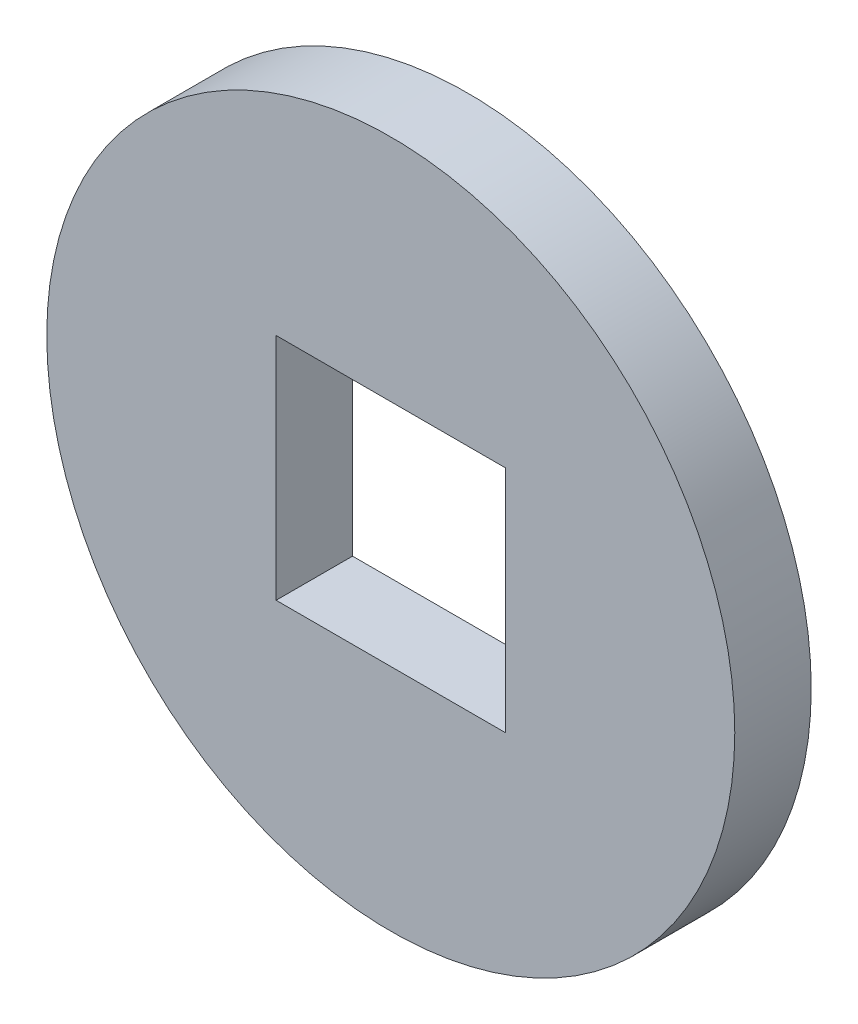
ISO-10303-21;
HEADER;
FILE_DESCRIPTION(('STEP AP214'),'2;1');
FILE_NAME('part.step','',(''),(''),'','','');
FILE_SCHEMA(('AUTOMOTIVE_DESIGN { 1 0 10303 214 1 1 1 1 }'));
ENDSEC;
DATA;
#1=APPLICATION_CONTEXT('core data for automotive mechanical design processes');
#2=APPLICATION_PROTOCOL_DEFINITION('international standard','automotive_design',2000,#1);
#3=PRODUCT_CONTEXT('',#1,'mechanical');
#4=PRODUCT('Part','Part','',(#3));
#5=PRODUCT_RELATED_PRODUCT_CATEGORY('part','',(#4));
#6=PRODUCT_DEFINITION_FORMATION('','',#4);
#7=PRODUCT_DEFINITION_CONTEXT('part definition',#1,'design');
#8=PRODUCT_DEFINITION('design','',#6,#7);
#9=PRODUCT_DEFINITION_SHAPE('','',#8);
#10=(LENGTH_UNIT() NAMED_UNIT(*) SI_UNIT(.MILLI.,.METRE.));
#11=(NAMED_UNIT(*) PLANE_ANGLE_UNIT() SI_UNIT($,.RADIAN.));
#12=(NAMED_UNIT(*) SI_UNIT($,.STERADIAN.) SOLID_ANGLE_UNIT());
#13=UNCERTAINTY_MEASURE_WITH_UNIT(LENGTH_MEASURE(1.E-05),#10,'distance_accuracy_value','');
#14=(GEOMETRIC_REPRESENTATION_CONTEXT(3) GLOBAL_UNCERTAINTY_ASSIGNED_CONTEXT((#13)) GLOBAL_UNIT_ASSIGNED_CONTEXT((#10,
#11,#12)) REPRESENTATION_CONTEXT('',''));
#15=CARTESIAN_POINT('',(0.,0.,0.));
#16=DIRECTION('',(0.,0.,1.));
#17=DIRECTION('',(1.,0.,0.));
#18=AXIS2_PLACEMENT_3D('',#15,#16,#17);
#19=CARTESIAN_POINT('',(0.,0.,1.));
#20=DIRECTION('',(0.,0.,1.));
#21=DIRECTION('',(1.,0.,0.));
#22=AXIS2_PLACEMENT_3D('',#19,#20,#21);
#23=PLANE('',#22);
#24=CARTESIAN_POINT('',(0.,0.,1.));
#25=DIRECTION('',(0.,0.,1.));
#26=DIRECTION('',(1.,0.,0.));
#27=AXIS2_PLACEMENT_3D('',#24,#25,#26);
#28=CIRCLE('',#27,4.5);
#29=CARTESIAN_POINT('',(4.5,0.,1.));
#30=VERTEX_POINT('',#29);
#31=EDGE_CURVE('E11',#30,#30,#28,.T.);
#32=ORIENTED_EDGE('',*,*,#31,.T.);
#33=EDGE_LOOP('',(#32));
#34=FACE_BOUND('',#33,.T.);
#35=DIRECTION('',(1.,0.,0.));
#36=VECTOR('',#35,1.);
#37=CARTESIAN_POINT('',(1.5,-1.5,1.));
#38=LINE('',#37,#36);
#39=CARTESIAN_POINT('',(-1.5,-1.5,1.));
#40=VERTEX_POINT('',#39);
#41=CARTESIAN_POINT('',(1.5,-1.5,1.));
#42=VERTEX_POINT('',#41);
#43=EDGE_CURVE('E84',#40,#42,#38,.T.);
#44=ORIENTED_EDGE('',*,*,#43,.F.);
#45=DIRECTION('',(0.,-1.,0.));
#46=VECTOR('',#45,1.);
#47=CARTESIAN_POINT('',(-1.5,1.5,1.));
#48=LINE('',#47,#46);
#49=CARTESIAN_POINT('',(-1.5,1.5,1.));
#50=VERTEX_POINT('',#49);
#51=EDGE_CURVE('E76',#50,#40,#48,.T.);
#52=ORIENTED_EDGE('',*,*,#51,.F.);
#53=DIRECTION('',(-1.,0.,0.));
#54=VECTOR('',#53,1.);
#55=CARTESIAN_POINT('',(1.5,1.5,1.));
#56=LINE('',#55,#54);
#57=CARTESIAN_POINT('',(1.5,1.5,1.));
#58=VERTEX_POINT('',#57);
#59=EDGE_CURVE('E97',#58,#50,#56,.T.);
#60=ORIENTED_EDGE('',*,*,#59,.F.);
#61=DIRECTION('',(0.,1.,0.));
#62=VECTOR('',#61,1.);
#63=CARTESIAN_POINT('',(1.5,1.5,1.));
#64=LINE('',#63,#62);
#65=EDGE_CURVE('E95',#42,#58,#64,.T.);
#66=ORIENTED_EDGE('',*,*,#65,.F.);
#67=EDGE_LOOP('',(#44,#52,#60,#66));
#68=FACE_BOUND('',#67,.T.);
#69=ADVANCED_FACE('F35',(#34,#68),#23,.T.);
#70=CARTESIAN_POINT('',(0.,0.,0.));
#71=DIRECTION('',(0.,0.,1.));
#72=DIRECTION('',(1.,0.,0.));
#73=AXIS2_PLACEMENT_3D('',#70,#71,#72);
#74=PLANE('',#73);
#75=CARTESIAN_POINT('',(0.,0.,0.));
#76=DIRECTION('',(0.,0.,1.));
#77=DIRECTION('',(1.,0.,0.));
#78=AXIS2_PLACEMENT_3D('',#75,#76,#77);
#79=CIRCLE('',#78,4.5);
#80=CARTESIAN_POINT('',(4.5,0.,0.));
#81=VERTEX_POINT('',#80);
#82=EDGE_CURVE('E39',#81,#81,#79,.T.);
#83=ORIENTED_EDGE('',*,*,#82,.F.);
#84=EDGE_LOOP('',(#83));
#85=FACE_BOUND('',#84,.T.);
#86=DIRECTION('',(0.,-1.,0.));
#87=VECTOR('',#86,1.);
#88=CARTESIAN_POINT('',(-1.5,1.5,0.));
#89=LINE('',#88,#87);
#90=CARTESIAN_POINT('',(-1.5,1.5,0.));
#91=VERTEX_POINT('',#90);
#92=CARTESIAN_POINT('',(-1.5,-1.5,0.));
#93=VERTEX_POINT('',#92);
#94=EDGE_CURVE('E58',#91,#93,#89,.T.);
#95=ORIENTED_EDGE('',*,*,#94,.T.);
#96=DIRECTION('',(1.,0.,0.));
#97=VECTOR('',#96,1.);
#98=CARTESIAN_POINT('',(1.5,-1.5,0.));
#99=LINE('',#98,#97);
#100=CARTESIAN_POINT('',(1.5,-1.5,0.));
#101=VERTEX_POINT('',#100);
#102=EDGE_CURVE('E91',#93,#101,#99,.T.);
#103=ORIENTED_EDGE('',*,*,#102,.T.);
#104=DIRECTION('',(0.,1.,0.));
#105=VECTOR('',#104,1.);
#106=CARTESIAN_POINT('',(1.5,1.5,0.));
#107=LINE('',#106,#105);
#108=CARTESIAN_POINT('',(1.5,1.5,0.));
#109=VERTEX_POINT('',#108);
#110=EDGE_CURVE('E103',#101,#109,#107,.T.);
#111=ORIENTED_EDGE('',*,*,#110,.T.);
#112=DIRECTION('',(-1.,0.,0.));
#113=VECTOR('',#112,1.);
#114=CARTESIAN_POINT('',(1.5,1.5,0.));
#115=LINE('',#114,#113);
#116=EDGE_CURVE('E85',#109,#91,#115,.T.);
#117=ORIENTED_EDGE('',*,*,#116,.T.);
#118=EDGE_LOOP('',(#95,#103,#111,#117));
#119=FACE_BOUND('',#118,.T.);
#120=ADVANCED_FACE('F114',(#85,#119),#74,.F.);
#121=CARTESIAN_POINT('',(0.,0.,1.));
#122=DIRECTION('',(0.,0.,-1.));
#123=DIRECTION('',(-1.,0.,0.));
#124=AXIS2_PLACEMENT_3D('',#121,#122,#123);
#125=CYLINDRICAL_SURFACE('',#124,4.5);
#126=ORIENTED_EDGE('',*,*,#31,.F.);
#127=EDGE_LOOP('',(#126));
#128=FACE_BOUND('',#127,.T.);
#129=ORIENTED_EDGE('',*,*,#82,.T.);
#130=EDGE_LOOP('',(#129));
#131=FACE_BOUND('',#130,.T.);
#132=ADVANCED_FACE('F37',(#128,#131),#125,.T.);
#133=CARTESIAN_POINT('',(-1.5,1.5,1.));
#134=DIRECTION('',(1.,0.,0.));
#135=DIRECTION('',(0.,1.,0.));
#136=AXIS2_PLACEMENT_3D('',#133,#134,#135);
#137=PLANE('',#136);
#138=ORIENTED_EDGE('',*,*,#94,.F.);
#139=DIRECTION('',(0.,0.,-1.));
#140=VECTOR('',#139,1.);
#141=CARTESIAN_POINT('',(-1.5,1.5,1.));
#142=LINE('',#141,#140);
#143=EDGE_CURVE('E80',#50,#91,#142,.T.);
#144=ORIENTED_EDGE('',*,*,#143,.F.);
#145=ORIENTED_EDGE('',*,*,#51,.T.);
#146=DIRECTION('',(0.,0.,-1.));
#147=VECTOR('',#146,1.);
#148=CARTESIAN_POINT('',(-1.5,-1.5,1.));
#149=LINE('',#148,#147);
#150=EDGE_CURVE('E79',#40,#93,#149,.T.);
#151=ORIENTED_EDGE('',*,*,#150,.T.);
#152=EDGE_LOOP('',(#138,#144,#145,#151));
#153=FACE_BOUND('',#152,.T.);
#154=ADVANCED_FACE('F78',(#153),#137,.T.);
#155=CARTESIAN_POINT('',(1.5,-1.5,1.));
#156=DIRECTION('',(0.,1.,0.));
#157=DIRECTION('',(-1.,0.,0.));
#158=AXIS2_PLACEMENT_3D('',#155,#156,#157);
#159=PLANE('',#158);
#160=ORIENTED_EDGE('',*,*,#102,.F.);
#161=ORIENTED_EDGE('',*,*,#150,.F.);
#162=ORIENTED_EDGE('',*,*,#43,.T.);
#163=DIRECTION('',(0.,0.,-1.));
#164=VECTOR('',#163,1.);
#165=CARTESIAN_POINT('',(1.5,-1.5,1.));
#166=LINE('',#165,#164);
#167=EDGE_CURVE('E92',#42,#101,#166,.T.);
#168=ORIENTED_EDGE('',*,*,#167,.T.);
#169=EDGE_LOOP('',(#160,#161,#162,#168));
#170=FACE_BOUND('',#169,.T.);
#171=ADVANCED_FACE('F88',(#170),#159,.T.);
#172=CARTESIAN_POINT('',(1.5,1.5,1.));
#173=DIRECTION('',(-1.,0.,0.));
#174=DIRECTION('',(0.,-1.,0.));
#175=AXIS2_PLACEMENT_3D('',#172,#173,#174);
#176=PLANE('',#175);
#177=ORIENTED_EDGE('',*,*,#110,.F.);
#178=ORIENTED_EDGE('',*,*,#167,.F.);
#179=ORIENTED_EDGE('',*,*,#65,.T.);
#180=DIRECTION('',(0.,0.,-1.));
#181=VECTOR('',#180,1.);
#182=CARTESIAN_POINT('',(1.5,1.5,1.));
#183=LINE('',#182,#181);
#184=EDGE_CURVE('E50',#58,#109,#183,.T.);
#185=ORIENTED_EDGE('',*,*,#184,.T.);
#186=EDGE_LOOP('',(#177,#178,#179,#185));
#187=FACE_BOUND('',#186,.T.);
#188=ADVANCED_FACE('F112',(#187),#176,.T.);
#189=CARTESIAN_POINT('',(1.5,1.5,1.));
#190=DIRECTION('',(0.,-1.,0.));
#191=DIRECTION('',(1.,0.,0.));
#192=AXIS2_PLACEMENT_3D('',#189,#190,#191);
#193=PLANE('',#192);
#194=ORIENTED_EDGE('',*,*,#116,.F.);
#195=ORIENTED_EDGE('',*,*,#184,.F.);
#196=ORIENTED_EDGE('',*,*,#59,.T.);
#197=ORIENTED_EDGE('',*,*,#143,.T.);
#198=EDGE_LOOP('',(#194,#195,#196,#197));
#199=FACE_BOUND('',#198,.T.);
#200=ADVANCED_FACE('F115',(#199),#193,.T.);
#201=CLOSED_SHELL('',(#69,#120,#132,#154,#171,#188,#200));
#202=MANIFOLD_SOLID_BREP('B2',#201);
#203=ADVANCED_BREP_SHAPE_REPRESENTATION('',(#18,#202),#14);
#204=SHAPE_DEFINITION_REPRESENTATION(#9,#203);
ENDSEC;
END-ISO-10303-21;
